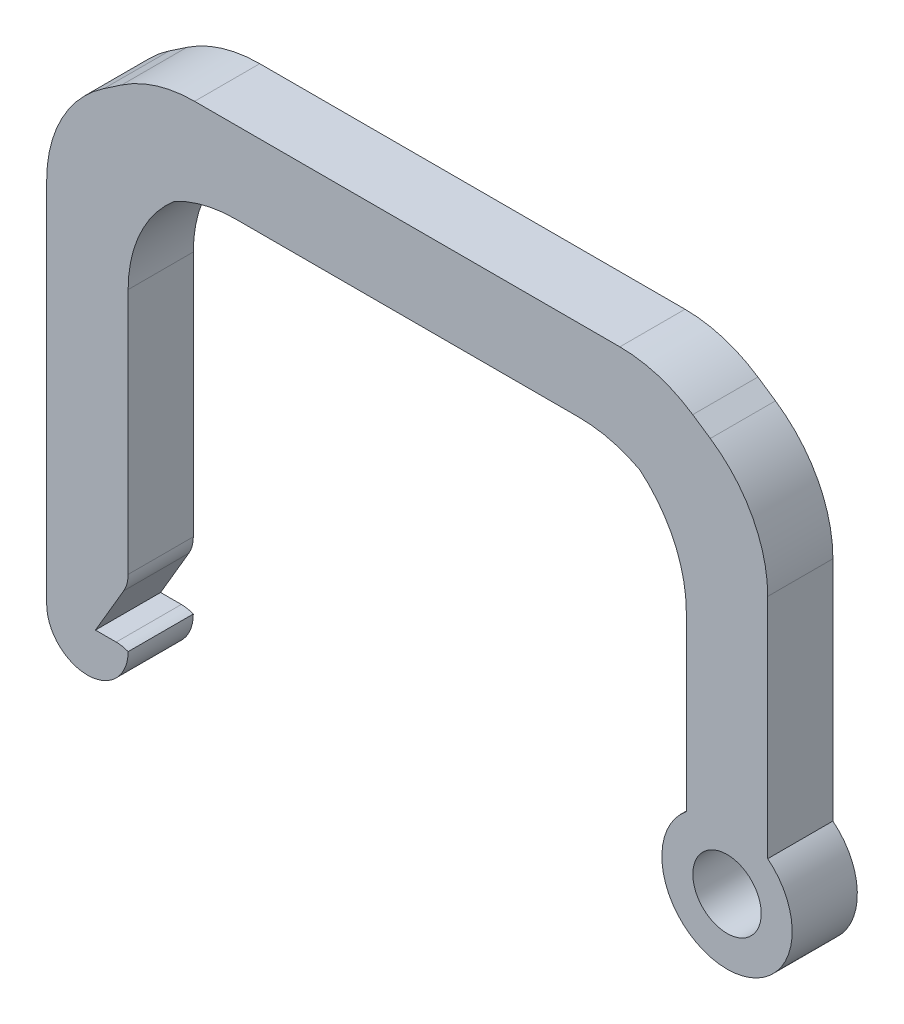
ISO-10303-21;
HEADER;
FILE_DESCRIPTION(('STEP AP214'),'2;1');
FILE_NAME('part.step','',(''),(''),'','','');
FILE_SCHEMA(('AUTOMOTIVE_DESIGN { 1 0 10303 214 1 1 1 1 }'));
ENDSEC;
DATA;
#1=APPLICATION_CONTEXT('core data for automotive mechanical design processes');
#2=APPLICATION_PROTOCOL_DEFINITION('international standard','automotive_design',2000,#1);
#3=PRODUCT_CONTEXT('',#1,'mechanical');
#4=PRODUCT('Part','Part','',(#3));
#5=PRODUCT_RELATED_PRODUCT_CATEGORY('part','',(#4));
#6=PRODUCT_DEFINITION_FORMATION('','',#4);
#7=PRODUCT_DEFINITION_CONTEXT('part definition',#1,'design');
#8=PRODUCT_DEFINITION('design','',#6,#7);
#9=PRODUCT_DEFINITION_SHAPE('','',#8);
#10=(LENGTH_UNIT() NAMED_UNIT(*) SI_UNIT(.MILLI.,.METRE.));
#11=(NAMED_UNIT(*) PLANE_ANGLE_UNIT() SI_UNIT($,.RADIAN.));
#12=(NAMED_UNIT(*) SI_UNIT($,.STERADIAN.) SOLID_ANGLE_UNIT());
#13=UNCERTAINTY_MEASURE_WITH_UNIT(LENGTH_MEASURE(1.E-05),#10,'distance_accuracy_value','');
#14=(GEOMETRIC_REPRESENTATION_CONTEXT(3) GLOBAL_UNCERTAINTY_ASSIGNED_CONTEXT((#13)) GLOBAL_UNIT_ASSIGNED_CONTEXT((#10,
#11,#12)) REPRESENTATION_CONTEXT('',''));
#15=CARTESIAN_POINT('',(0.,0.,0.));
#16=DIRECTION('',(0.,0.,1.));
#17=DIRECTION('',(1.,0.,0.));
#18=AXIS2_PLACEMENT_3D('',#15,#16,#17);
#19=CARTESIAN_POINT('',(22.1323005804403,-4.47354322776596,4.));
#20=DIRECTION('',(-0.559192903470745,-0.829037572555043,0.));
#21=DIRECTION('',(0.829037572555043,-0.559192903470745,0.));
#22=AXIS2_PLACEMENT_3D('',#19,#20,#21);
#23=PLANE('',#22);
#24=DIRECTION('',(-0.829037572555043,0.559192903470745,0.));
#25=VECTOR('',#24,1.);
#26=CARTESIAN_POINT('',(22.1323005804403,-4.47354322776596,4.));
#27=LINE('',#26,#25);
#28=CARTESIAN_POINT('',(18.6058438082063,-2.09491810061746,4.));
#29=VERTEX_POINT('',#28);
#30=CARTESIAN_POINT('',(17.5276977760967,-1.36769941955966,4.));
#31=VERTEX_POINT('',#30);
#32=EDGE_CURVE('E221',#29,#31,#27,.T.);
#33=ORIENTED_EDGE('',*,*,#32,.F.);
#34=DIRECTION('',(0.,0.,-1.));
#35=VECTOR('',#34,1.);
#36=CARTESIAN_POINT('',(18.6058438082063,-2.09491810061746,4.));
#37=LINE('',#36,#35);
#38=CARTESIAN_POINT('',(18.6058438082063,-2.09491810061746,0.));
#39=VERTEX_POINT('',#38);
#40=EDGE_CURVE('E279',#29,#39,#37,.T.);
#41=ORIENTED_EDGE('',*,*,#40,.T.);
#42=DIRECTION('',(-0.829037572555043,0.559192903470745,0.));
#43=VECTOR('',#42,1.);
#44=CARTESIAN_POINT('',(22.1323005804403,-4.47354322776596,0.));
#45=LINE('',#44,#43);
#46=CARTESIAN_POINT('',(17.5276977760967,-1.36769941955966,0.));
#47=VERTEX_POINT('',#46);
#48=EDGE_CURVE('E245',#39,#47,#45,.T.);
#49=ORIENTED_EDGE('',*,*,#48,.T.);
#50=DIRECTION('',(0.,0.,-1.));
#51=VECTOR('',#50,1.);
#52=CARTESIAN_POINT('',(17.5276977760967,-1.36769941955966,4.));
#53=LINE('',#52,#51);
#54=EDGE_CURVE('E277',#47,#31,#53,.F.);
#55=ORIENTED_EDGE('',*,*,#54,.T.);
#56=EDGE_LOOP('',(#33,#41,#49,#55));
#57=FACE_BOUND('',#56,.T.);
#58=ADVANCED_FACE('F33',(#57),#23,.F.);
#59=CARTESIAN_POINT('',(-15.5,0.,4.));
#60=DIRECTION('',(0.,-1.,0.));
#61=DIRECTION('',(0.,0.,-1.));
#62=AXIS2_PLACEMENT_3D('',#59,#60,#61);
#63=PLANE('',#62);
#64=DIRECTION('',(-1.,0.,0.));
#65=VECTOR('',#64,1.);
#66=CARTESIAN_POINT('',(-15.5,0.,4.));
#67=LINE('',#66,#65);
#68=CARTESIAN_POINT('',(13.0541545483307,0.,4.));
#69=VERTEX_POINT('',#68);
#70=CARTESIAN_POINT('',(-13.0541545483307,0.,4.));
#71=VERTEX_POINT('',#70);
#72=EDGE_CURVE('E224',#69,#71,#67,.T.);
#73=ORIENTED_EDGE('',*,*,#72,.F.);
#74=DIRECTION('',(0.,0.,-1.));
#75=VECTOR('',#74,1.);
#76=CARTESIAN_POINT('',(13.0541545483307,0.,4.));
#77=LINE('',#76,#75);
#78=CARTESIAN_POINT('',(13.0541545483307,0.,0.));
#79=VERTEX_POINT('',#78);
#80=EDGE_CURVE('E304',#69,#79,#77,.T.);
#81=ORIENTED_EDGE('',*,*,#80,.T.);
#82=DIRECTION('',(-1.,0.,0.));
#83=VECTOR('',#82,1.);
#84=CARTESIAN_POINT('',(-15.5,0.,0.));
#85=LINE('',#84,#83);
#86=CARTESIAN_POINT('',(-13.0541545483307,0.,0.));
#87=VERTEX_POINT('',#86);
#88=EDGE_CURVE('E248',#79,#87,#85,.T.);
#89=ORIENTED_EDGE('',*,*,#88,.T.);
#90=DIRECTION('',(0.,0.,-1.));
#91=VECTOR('',#90,1.);
#92=CARTESIAN_POINT('',(-13.0541545483307,0.,4.));
#93=LINE('',#92,#91);
#94=EDGE_CURVE('E302',#87,#71,#93,.F.);
#95=ORIENTED_EDGE('',*,*,#94,.T.);
#96=EDGE_LOOP('',(#73,#81,#89,#95));
#97=FACE_BOUND('',#96,.T.);
#98=ADVANCED_FACE('F426',(#97),#63,.F.);
#99=CARTESIAN_POINT('',(-15.5,0.,4.));
#100=DIRECTION('',(0.559192903470745,-0.829037572555043,0.));
#101=DIRECTION('',(0.829037572555043,0.559192903470745,0.));
#102=AXIS2_PLACEMENT_3D('',#99,#100,#101);
#103=PLANE('',#102);
#104=DIRECTION('',(-0.829037572555043,-0.559192903470745,0.));
#105=VECTOR('',#104,1.);
#106=CARTESIAN_POINT('',(-15.5,0.,4.));
#107=LINE('',#106,#105);
#108=CARTESIAN_POINT('',(-17.5276977760967,-1.36769941955966,4.));
#109=VERTEX_POINT('',#108);
#110=CARTESIAN_POINT('',(-18.6058438082063,-2.09491810061746,4.));
#111=VERTEX_POINT('',#110);
#112=EDGE_CURVE('E228',#109,#111,#107,.T.);
#113=ORIENTED_EDGE('',*,*,#112,.F.);
#114=DIRECTION('',(0.,0.,-1.));
#115=VECTOR('',#114,1.);
#116=CARTESIAN_POINT('',(-17.5276977760967,-1.36769941955966,4.));
#117=LINE('',#116,#115);
#118=CARTESIAN_POINT('',(-17.5276977760967,-1.36769941955966,0.));
#119=VERTEX_POINT('',#118);
#120=EDGE_CURVE('E309',#109,#119,#117,.T.);
#121=ORIENTED_EDGE('',*,*,#120,.T.);
#122=DIRECTION('',(-0.829037572555043,-0.559192903470745,0.));
#123=VECTOR('',#122,1.);
#124=CARTESIAN_POINT('',(-15.5,0.,0.));
#125=LINE('',#124,#123);
#126=CARTESIAN_POINT('',(-18.6058438082063,-2.09491810061746,0.));
#127=VERTEX_POINT('',#126);
#128=EDGE_CURVE('E252',#119,#127,#125,.T.);
#129=ORIENTED_EDGE('',*,*,#128,.T.);
#130=DIRECTION('',(0.,0.,-1.));
#131=VECTOR('',#130,1.);
#132=CARTESIAN_POINT('',(-18.6058438082063,-2.09491810061746,4.));
#133=LINE('',#132,#131);
#134=EDGE_CURVE('E307',#127,#111,#133,.F.);
#135=ORIENTED_EDGE('',*,*,#134,.T.);
#136=EDGE_LOOP('',(#113,#121,#129,#135));
#137=FACE_BOUND('',#136,.T.);
#138=ADVANCED_FACE('F434',(#137),#103,.F.);
#139=CARTESIAN_POINT('',(-22.1323005804403,-4.47354322776596,4.));
#140=DIRECTION('',(1.,0.,0.));
#141=DIRECTION('',(0.,1.,0.));
#142=AXIS2_PLACEMENT_3D('',#139,#140,#141);
#143=PLANE('',#142);
#144=DIRECTION('',(0.,-1.,0.));
#145=VECTOR('',#144,1.);
#146=CARTESIAN_POINT('',(-22.1323005804403,-4.47354322776596,0.));
#147=LINE('',#146,#145);
#148=CARTESIAN_POINT('',(-22.1323005804403,-8.72721868105781,0.));
#149=VERTEX_POINT('',#148);
#150=CARTESIAN_POINT('',(-22.1323005804403,-31.2959645173537,0.));
#151=VERTEX_POINT('',#150);
#152=EDGE_CURVE('E255',#149,#151,#147,.T.);
#153=ORIENTED_EDGE('',*,*,#152,.T.);
#154=DIRECTION('',(0.,0.,1.));
#155=VECTOR('',#154,1.);
#156=CARTESIAN_POINT('',(-22.1323005804403,-31.2959645173537,4.));
#157=LINE('',#156,#155);
#158=CARTESIAN_POINT('',(-22.1323005804403,-31.2959645173537,4.));
#159=VERTEX_POINT('',#158);
#160=EDGE_CURVE('E349',#151,#159,#157,.T.);
#161=ORIENTED_EDGE('',*,*,#160,.T.);
#162=DIRECTION('',(0.,-1.,0.));
#163=VECTOR('',#162,1.);
#164=CARTESIAN_POINT('',(-22.1323005804403,-4.47354322776596,4.));
#165=LINE('',#164,#163);
#166=CARTESIAN_POINT('',(-22.1323005804403,-8.72721868105781,4.));
#167=VERTEX_POINT('',#166);
#168=EDGE_CURVE('E231',#167,#159,#165,.T.);
#169=ORIENTED_EDGE('',*,*,#168,.F.);
#170=DIRECTION('',(0.,0.,-1.));
#171=VECTOR('',#170,1.);
#172=CARTESIAN_POINT('',(-22.1323005804403,-8.72721868105781,4.));
#173=LINE('',#172,#171);
#174=EDGE_CURVE('E312',#167,#149,#173,.T.);
#175=ORIENTED_EDGE('',*,*,#174,.T.);
#176=EDGE_LOOP('',(#153,#161,#169,#175));
#177=FACE_BOUND('',#176,.T.);
#178=ADVANCED_FACE('F443',(#177),#143,.F.);
#179=CARTESIAN_POINT('',(-17.1323005804403,-22.7959645173537,4.));
#180=DIRECTION('',(-1.,0.,0.));
#181=DIRECTION('',(0.,0.,1.));
#182=AXIS2_PLACEMENT_3D('',#179,#180,#181);
#183=PLANE('',#182);
#184=DIRECTION('',(0.,1.,0.));
#185=VECTOR('',#184,1.);
#186=CARTESIAN_POINT('',(-17.1323005804403,-22.7959645173537,4.));
#187=LINE('',#186,#185);
#188=CARTESIAN_POINT('',(-17.1323005804403,-27.1916649730662,4.));
#189=VERTEX_POINT('',#188);
#190=CARTESIAN_POINT('',(-17.1323005804403,-12.0496399706456,4.));
#191=VERTEX_POINT('',#190);
#192=EDGE_CURVE('E234',#189,#191,#187,.T.);
#193=ORIENTED_EDGE('',*,*,#192,.F.);
#194=DIRECTION('',(0.,0.,1.));
#195=VECTOR('',#194,1.);
#196=CARTESIAN_POINT('',(-17.1323005804403,-27.1916649730662,4.));
#197=LINE('',#196,#195);
#198=CARTESIAN_POINT('',(-17.1323005804403,-27.1916649730662,0.));
#199=VERTEX_POINT('',#198);
#200=EDGE_CURVE('E359',#189,#199,#197,.F.);
#201=ORIENTED_EDGE('',*,*,#200,.T.);
#202=DIRECTION('',(0.,1.,0.));
#203=VECTOR('',#202,1.);
#204=CARTESIAN_POINT('',(-17.1323005804403,-22.7959645173537,0.));
#205=LINE('',#204,#203);
#206=CARTESIAN_POINT('',(-17.1323005804403,-12.0496399706456,0.));
#207=VERTEX_POINT('',#206);
#208=EDGE_CURVE('E258',#199,#207,#205,.T.);
#209=ORIENTED_EDGE('',*,*,#208,.T.);
#210=DIRECTION('',(0.,0.,-1.));
#211=VECTOR('',#210,1.);
#212=CARTESIAN_POINT('',(-17.1323005804403,-12.0496399706456,4.));
#213=LINE('',#212,#211);
#214=EDGE_CURVE('E271',#207,#191,#213,.F.);
#215=ORIENTED_EDGE('',*,*,#214,.T.);
#216=EDGE_LOOP('',(#193,#201,#209,#215));
#217=FACE_BOUND('',#216,.T.);
#218=ADVANCED_FACE('F372',(#217),#183,.F.);
#219=CARTESIAN_POINT('',(-12.9871127176651,-5.,4.));
#220=DIRECTION('',(0.,1.,0.));
#221=DIRECTION('',(-1.,0.,0.));
#222=AXIS2_PLACEMENT_3D('',#219,#220,#221);
#223=PLANE('',#222);
#224=DIRECTION('',(1.,0.,0.));
#225=VECTOR('',#224,1.);
#226=CARTESIAN_POINT('',(-12.9871127176651,-5.,4.));
#227=LINE('',#226,#225);
#228=CARTESIAN_POINT('',(-10.5412672659959,-5.,4.));
#229=VERTEX_POINT('',#228);
#230=CARTESIAN_POINT('',(10.5412672659959,-5.,4.));
#231=VERTEX_POINT('',#230);
#232=EDGE_CURVE('E236',#229,#231,#227,.T.);
#233=ORIENTED_EDGE('',*,*,#232,.F.);
#234=DIRECTION('',(0.,0.,-1.));
#235=VECTOR('',#234,1.);
#236=CARTESIAN_POINT('',(-10.5412672659959,-5.,0.));
#237=LINE('',#236,#235);
#238=CARTESIAN_POINT('',(-10.5412672659959,-5.,0.));
#239=VERTEX_POINT('',#238);
#240=EDGE_CURVE('E268',#229,#239,#237,.T.);
#241=ORIENTED_EDGE('',*,*,#240,.T.);
#242=DIRECTION('',(1.,0.,0.));
#243=VECTOR('',#242,1.);
#244=CARTESIAN_POINT('',(-12.9871127176651,-5.,0.));
#245=LINE('',#244,#243);
#246=CARTESIAN_POINT('',(10.5412672659959,-5.,0.));
#247=VERTEX_POINT('',#246);
#248=EDGE_CURVE('E260',#239,#247,#245,.T.);
#249=ORIENTED_EDGE('',*,*,#248,.T.);
#250=DIRECTION('',(0.,0.,-1.));
#251=VECTOR('',#250,1.);
#252=CARTESIAN_POINT('',(10.5412672659958,-5.,4.));
#253=LINE('',#252,#251);
#254=EDGE_CURVE('E244',#247,#231,#253,.F.);
#255=ORIENTED_EDGE('',*,*,#254,.T.);
#256=EDGE_LOOP('',(#233,#241,#249,#255));
#257=FACE_BOUND('',#256,.T.);
#258=ADVANCED_FACE('F385',(#257),#223,.F.);
#259=CARTESIAN_POINT('',(17.1323005804403,-7.79596451735372,4.));
#260=DIRECTION('',(1.,0.,0.));
#261=DIRECTION('',(0.,1.,0.));
#262=AXIS2_PLACEMENT_3D('',#259,#260,#261);
#263=PLANE('',#262);
#264=DIRECTION('',(0.,-1.,0.));
#265=VECTOR('',#264,1.);
#266=CARTESIAN_POINT('',(17.1323005804403,-7.79596451735372,0.));
#267=LINE('',#266,#265);
#268=CARTESIAN_POINT('',(17.1323005804403,-12.0496399706456,0.));
#269=VERTEX_POINT('',#268);
#270=CARTESIAN_POINT('',(17.1323005804403,-22.6734655181545,0.));
#271=VERTEX_POINT('',#270);
#272=EDGE_CURVE('E263',#269,#271,#267,.T.);
#273=ORIENTED_EDGE('',*,*,#272,.T.);
#274=DIRECTION('',(0.,0.,1.));
#275=VECTOR('',#274,1.);
#276=CARTESIAN_POINT('',(17.1323005804403,-22.6734655181545,0.));
#277=LINE('',#276,#275);
#278=CARTESIAN_POINT('',(17.1323005804403,-22.6734655181545,4.));
#279=VERTEX_POINT('',#278);
#280=EDGE_CURVE('E217',#271,#279,#277,.T.);
#281=ORIENTED_EDGE('',*,*,#280,.T.);
#282=DIRECTION('',(0.,-1.,0.));
#283=VECTOR('',#282,1.);
#284=CARTESIAN_POINT('',(17.1323005804403,-7.79596451735372,4.));
#285=LINE('',#284,#283);
#286=CARTESIAN_POINT('',(17.1323005804403,-12.0496399706456,4.));
#287=VERTEX_POINT('',#286);
#288=EDGE_CURVE('E239',#287,#279,#285,.T.);
#289=ORIENTED_EDGE('',*,*,#288,.F.);
#290=DIRECTION('',(0.,0.,-1.));
#291=VECTOR('',#290,1.);
#292=CARTESIAN_POINT('',(17.1323005804403,-12.0496399706456,0.));
#293=LINE('',#292,#291);
#294=EDGE_CURVE('E274',#287,#269,#293,.T.);
#295=ORIENTED_EDGE('',*,*,#294,.T.);
#296=EDGE_LOOP('',(#273,#281,#289,#295));
#297=FACE_BOUND('',#296,.T.);
#298=ADVANCED_FACE('F398',(#297),#263,.F.);
#299=CARTESIAN_POINT('',(22.1323005804403,-22.7959645173537,4.));
#300=DIRECTION('',(-1.,0.,0.));
#301=DIRECTION('',(0.,0.,1.));
#302=AXIS2_PLACEMENT_3D('',#299,#300,#301);
#303=PLANE('',#302);
#304=DIRECTION('',(0.,1.,0.));
#305=VECTOR('',#304,1.);
#306=CARTESIAN_POINT('',(22.1323005804403,-22.7959645173537,4.));
#307=LINE('',#306,#305);
#308=CARTESIAN_POINT('',(22.1323005804403,-22.6734655181545,4.));
#309=VERTEX_POINT('',#308);
#310=CARTESIAN_POINT('',(22.1323005804403,-8.7272186810578,4.));
#311=VERTEX_POINT('',#310);
#312=EDGE_CURVE('E242',#309,#311,#307,.T.);
#313=ORIENTED_EDGE('',*,*,#312,.F.);
#314=DIRECTION('',(0.,0.,1.));
#315=VECTOR('',#314,1.);
#316=CARTESIAN_POINT('',(22.1323005804403,-22.6734655181545,0.));
#317=LINE('',#316,#315);
#318=CARTESIAN_POINT('',(22.1323005804403,-22.6734655181545,0.));
#319=VERTEX_POINT('',#318);
#320=EDGE_CURVE('E212',#309,#319,#317,.F.);
#321=ORIENTED_EDGE('',*,*,#320,.T.);
#322=DIRECTION('',(0.,1.,0.));
#323=VECTOR('',#322,1.);
#324=CARTESIAN_POINT('',(22.1323005804403,-22.7959645173537,0.));
#325=LINE('',#324,#323);
#326=CARTESIAN_POINT('',(22.1323005804403,-8.7272186810578,0.));
#327=VERTEX_POINT('',#326);
#328=EDGE_CURVE('E225',#319,#327,#325,.T.);
#329=ORIENTED_EDGE('',*,*,#328,.T.);
#330=DIRECTION('',(0.,0.,-1.));
#331=VECTOR('',#330,1.);
#332=CARTESIAN_POINT('',(22.1323005804403,-8.7272186810578,4.));
#333=LINE('',#332,#331);
#334=EDGE_CURVE('E291',#327,#311,#333,.F.);
#335=ORIENTED_EDGE('',*,*,#334,.T.);
#336=EDGE_LOOP('',(#313,#321,#329,#335));
#337=FACE_BOUND('',#336,.T.);
#338=ADVANCED_FACE('F408',(#337),#303,.F.);
#339=CARTESIAN_POINT('',(0.,0.,4.));
#340=DIRECTION('',(0.,0.,1.));
#341=DIRECTION('',(1.,0.,0.));
#342=AXIS2_PLACEMENT_3D('',#339,#340,#341);
#343=PLANE('',#342);
#344=CARTESIAN_POINT('',(-19.6323005804403,-31.2959645173537,4.));
#345=DIRECTION('',(0.,0.,1.));
#346=DIRECTION('',(1.,0.,0.));
#347=AXIS2_PLACEMENT_3D('',#344,#345,#346);
#348=CIRCLE('',#347,2.5);
#349=CARTESIAN_POINT('',(-19.6323005804403,-33.7959645173537,4.));
#350=VERTEX_POINT('',#349);
#351=CARTESIAN_POINT('',(-17.1323005804403,-31.2959645173537,4.));
#352=VERTEX_POINT('',#351);
#353=EDGE_CURVE('E340',#350,#352,#348,.T.);
#354=ORIENTED_EDGE('',*,*,#353,.T.);
#355=CARTESIAN_POINT('',(-17.8665254026191,-33.1563176855711,4.));
#356=DIRECTION('',(0.,0.,1.));
#357=DIRECTION('',(1.,0.,0.));
#358=AXIS2_PLACEMENT_3D('',#355,#356,#357);
#359=CIRCLE('',#358,2.);
#360=CARTESIAN_POINT('',(-17.8665254026191,-31.1563176855711,4.));
#361=VERTEX_POINT('',#360);
#362=EDGE_CURVE('E55',#352,#361,#359,.T.);
#363=ORIENTED_EDGE('',*,*,#362,.T.);
#364=DIRECTION('',(1.,0.,0.));
#365=VECTOR('',#364,1.);
#366=CARTESIAN_POINT('',(-17.1323005804403,-31.1563176855711,4.));
#367=LINE('',#366,#365);
#368=CARTESIAN_POINT('',(-19.1396490556001,-31.1563176855711,4.));
#369=VERTEX_POINT('',#368);
#370=EDGE_CURVE('E196',#369,#361,#367,.T.);
#371=ORIENTED_EDGE('',*,*,#370,.F.);
#372=DIRECTION('',(-0.506056446293962,-0.862500361254606,0.));
#373=VECTOR('',#372,1.);
#374=CARTESIAN_POINT('',(-19.1396490556001,-31.1563176855711,4.));
#375=LINE('',#374,#373);
#376=CARTESIAN_POINT('',(-17.4072998579311,-28.2037778656542,4.));
#377=VERTEX_POINT('',#376);
#378=EDGE_CURVE('E189',#377,#369,#375,.T.);
#379=ORIENTED_EDGE('',*,*,#378,.F.);
#380=CARTESIAN_POINT('',(-19.1323005804403,-27.1916649730662,4.));
#381=DIRECTION('',(0.,0.,1.));
#382=DIRECTION('',(1.,0.,0.));
#383=AXIS2_PLACEMENT_3D('',#380,#381,#382);
#384=CIRCLE('',#383,2.);
#385=EDGE_CURVE('E357',#377,#189,#384,.T.);
#386=ORIENTED_EDGE('',*,*,#385,.T.);
#387=ORIENTED_EDGE('',*,*,#192,.T.);
#388=CARTESIAN_POINT('',(-9.13230058044034,-12.0496399706456,4.));
#389=DIRECTION('',(0.,0.,1.));
#390=DIRECTION('',(1.,0.,0.));
#391=AXIS2_PLACEMENT_3D('',#388,#389,#390);
#392=CIRCLE('',#391,8.);
#393=CARTESIAN_POINT('',(-14.285018737652,-5.9300406706635,4.));
#394=VERTEX_POINT('',#393);
#395=EDGE_CURVE('E322',#191,#394,#392,.F.);
#396=ORIENTED_EDGE('',*,*,#395,.T.);
#397=CARTESIAN_POINT('',(-10.5412672659959,-13.,4.));
#398=DIRECTION('',(0.,0.,1.));
#399=DIRECTION('',(1.,0.,0.));
#400=AXIS2_PLACEMENT_3D('',#397,#398,#399);
#401=CIRCLE('',#400,8.);
#402=EDGE_CURVE('E317',#394,#229,#401,.F.);
#403=ORIENTED_EDGE('',*,*,#402,.T.);
#404=ORIENTED_EDGE('',*,*,#232,.T.);
#405=CARTESIAN_POINT('',(10.5412672659958,-13.,4.));
#406=DIRECTION('',(0.,0.,1.));
#407=DIRECTION('',(1.,0.,0.));
#408=AXIS2_PLACEMENT_3D('',#405,#406,#407);
#409=CIRCLE('',#408,8.);
#410=CARTESIAN_POINT('',(14.285018737652,-5.9300406706635,4.));
#411=VERTEX_POINT('',#410);
#412=EDGE_CURVE('E330',#231,#411,#409,.F.);
#413=ORIENTED_EDGE('',*,*,#412,.T.);
#414=CARTESIAN_POINT('',(9.13230058044034,-12.0496399706456,4.));
#415=DIRECTION('',(0.,0.,1.));
#416=DIRECTION('',(1.,0.,0.));
#417=AXIS2_PLACEMENT_3D('',#414,#415,#416);
#418=CIRCLE('',#417,8.);
#419=EDGE_CURVE('E326',#411,#287,#418,.F.);
#420=ORIENTED_EDGE('',*,*,#419,.T.);
#421=ORIENTED_EDGE('',*,*,#288,.T.);
#422=CARTESIAN_POINT('',(19.6323005804403,-25.7959645173537,4.));
#423=DIRECTION('',(0.,0.,1.));
#424=DIRECTION('',(1.,0.,0.));
#425=AXIS2_PLACEMENT_3D('',#422,#423,#424);
#426=CIRCLE('',#425,4.);
#427=EDGE_CURVE('E213',#279,#309,#426,.T.);
#428=ORIENTED_EDGE('',*,*,#427,.T.);
#429=ORIENTED_EDGE('',*,*,#312,.T.);
#430=CARTESIAN_POINT('',(14.1323005804403,-8.7272186810578,4.));
#431=DIRECTION('',(0.,0.,1.));
#432=DIRECTION('',(1.,0.,0.));
#433=AXIS2_PLACEMENT_3D('',#430,#431,#432);
#434=CIRCLE('',#433,8.);
#435=EDGE_CURVE('E300',#311,#29,#434,.T.);
#436=ORIENTED_EDGE('',*,*,#435,.T.);
#437=ORIENTED_EDGE('',*,*,#32,.T.);
#438=CARTESIAN_POINT('',(13.0541545483307,-8.,4.));
#439=DIRECTION('',(0.,0.,1.));
#440=DIRECTION('',(1.,0.,0.));
#441=AXIS2_PLACEMENT_3D('',#438,#439,#440);
#442=CIRCLE('',#441,8.);
#443=EDGE_CURVE('E298',#31,#69,#442,.T.);
#444=ORIENTED_EDGE('',*,*,#443,.T.);
#445=ORIENTED_EDGE('',*,*,#72,.T.);
#446=CARTESIAN_POINT('',(-13.0541545483307,-8.,4.));
#447=DIRECTION('',(0.,0.,1.));
#448=DIRECTION('',(1.,0.,0.));
#449=AXIS2_PLACEMENT_3D('',#446,#447,#448);
#450=CIRCLE('',#449,8.);
#451=EDGE_CURVE('E296',#71,#109,#450,.T.);
#452=ORIENTED_EDGE('',*,*,#451,.T.);
#453=ORIENTED_EDGE('',*,*,#112,.T.);
#454=CARTESIAN_POINT('',(-14.1323005804403,-8.72721868105781,4.));
#455=DIRECTION('',(0.,0.,1.));
#456=DIRECTION('',(1.,0.,0.));
#457=AXIS2_PLACEMENT_3D('',#454,#455,#456);
#458=CIRCLE('',#457,8.);
#459=EDGE_CURVE('E294',#111,#167,#458,.T.);
#460=ORIENTED_EDGE('',*,*,#459,.T.);
#461=ORIENTED_EDGE('',*,*,#168,.T.);
#462=CARTESIAN_POINT('',(-19.6323005804403,-31.2959645173537,4.));
#463=DIRECTION('',(0.,0.,1.));
#464=DIRECTION('',(1.,0.,0.));
#465=AXIS2_PLACEMENT_3D('',#462,#463,#464);
#466=CIRCLE('',#465,2.5);
#467=EDGE_CURVE('E332',#159,#350,#466,.T.);
#468=ORIENTED_EDGE('',*,*,#467,.T.);
#469=EDGE_LOOP('',(#354,#363,#371,#379,#386,#387,#396,#403,#404,#413,#420,#421,#428,#429,#436,
#437,#444,#445,#452,#453,#460,#461,#468));
#470=FACE_BOUND('',#469,.T.);
#471=CARTESIAN_POINT('',(19.6323005804403,-25.7959645173537,4.));
#472=DIRECTION('',(0.,0.,1.));
#473=DIRECTION('',(1.,0.,0.));
#474=AXIS2_PLACEMENT_3D('',#471,#472,#473);
#475=CIRCLE('',#474,2.1);
#476=CARTESIAN_POINT('',(21.7323005804403,-25.7959645173537,4.));
#477=VERTEX_POINT('',#476);
#478=EDGE_CURVE('E206',#477,#477,#475,.T.);
#479=ORIENTED_EDGE('',*,*,#478,.F.);
#480=EDGE_LOOP('',(#479));
#481=FACE_BOUND('',#480,.T.);
#482=ADVANCED_FACE('F202',(#470,#481),#343,.T.);
#483=CARTESIAN_POINT('',(0.,0.,0.));
#484=DIRECTION('',(0.,0.,1.));
#485=DIRECTION('',(1.,0.,0.));
#486=AXIS2_PLACEMENT_3D('',#483,#484,#485);
#487=PLANE('',#486);
#488=CARTESIAN_POINT('',(19.6323005804403,-25.7959645173537,0.));
#489=DIRECTION('',(0.,0.,1.));
#490=DIRECTION('',(1.,0.,0.));
#491=AXIS2_PLACEMENT_3D('',#488,#489,#490);
#492=CIRCLE('',#491,2.1);
#493=CARTESIAN_POINT('',(21.7323005804403,-25.7959645173537,0.));
#494=VERTEX_POINT('',#493);
#495=EDGE_CURVE('E209',#494,#494,#492,.T.);
#496=ORIENTED_EDGE('',*,*,#495,.T.);
#497=EDGE_LOOP('',(#496));
#498=FACE_BOUND('',#497,.T.);
#499=DIRECTION('',(1.,0.,0.));
#500=VECTOR('',#499,1.);
#501=CARTESIAN_POINT('',(0.,-31.1563176855711,0.));
#502=LINE('',#501,#500);
#503=CARTESIAN_POINT('',(-19.1396490556001,-31.1563176855711,0.));
#504=VERTEX_POINT('',#503);
#505=CARTESIAN_POINT('',(-17.8665254026191,-31.1563176855711,0.));
#506=VERTEX_POINT('',#505);
#507=EDGE_CURVE('E199',#504,#506,#502,.T.);
#508=ORIENTED_EDGE('',*,*,#507,.T.);
#509=CARTESIAN_POINT('',(-17.8665254026191,-33.1563176855711,0.));
#510=DIRECTION('',(0.,0.,1.));
#511=DIRECTION('',(1.,0.,0.));
#512=AXIS2_PLACEMENT_3D('',#509,#510,#511);
#513=CIRCLE('',#512,2.);
#514=CARTESIAN_POINT('',(-17.1323005804403,-31.2959645173537,0.));
#515=VERTEX_POINT('',#514);
#516=EDGE_CURVE('E11',#506,#515,#513,.F.);
#517=ORIENTED_EDGE('',*,*,#516,.T.);
#518=CARTESIAN_POINT('',(-19.6323005804403,-31.2959645173537,0.));
#519=DIRECTION('',(0.,0.,1.));
#520=DIRECTION('',(1.,0.,0.));
#521=AXIS2_PLACEMENT_3D('',#518,#519,#520);
#522=CIRCLE('',#521,2.5);
#523=CARTESIAN_POINT('',(-19.6323005804403,-33.7959645173537,0.));
#524=VERTEX_POINT('',#523);
#525=EDGE_CURVE('E347',#515,#524,#522,.F.);
#526=ORIENTED_EDGE('',*,*,#525,.T.);
#527=CARTESIAN_POINT('',(-19.6323005804403,-31.2959645173537,0.));
#528=DIRECTION('',(0.,0.,1.));
#529=DIRECTION('',(1.,0.,0.));
#530=AXIS2_PLACEMENT_3D('',#527,#528,#529);
#531=CIRCLE('',#530,2.5);
#532=EDGE_CURVE('E345',#524,#151,#531,.F.);
#533=ORIENTED_EDGE('',*,*,#532,.T.);
#534=ORIENTED_EDGE('',*,*,#152,.F.);
#535=CARTESIAN_POINT('',(-14.1323005804403,-8.72721868105781,0.));
#536=DIRECTION('',(0.,0.,1.));
#537=DIRECTION('',(1.,0.,0.));
#538=AXIS2_PLACEMENT_3D('',#535,#536,#537);
#539=CIRCLE('',#538,8.);
#540=EDGE_CURVE('E282',#149,#127,#539,.F.);
#541=ORIENTED_EDGE('',*,*,#540,.T.);
#542=ORIENTED_EDGE('',*,*,#128,.F.);
#543=CARTESIAN_POINT('',(-13.0541545483307,-8.,0.));
#544=DIRECTION('',(0.,0.,1.));
#545=DIRECTION('',(1.,0.,0.));
#546=AXIS2_PLACEMENT_3D('',#543,#544,#545);
#547=CIRCLE('',#546,8.);
#548=EDGE_CURVE('E284',#119,#87,#547,.F.);
#549=ORIENTED_EDGE('',*,*,#548,.T.);
#550=ORIENTED_EDGE('',*,*,#88,.F.);
#551=CARTESIAN_POINT('',(13.0541545483307,-8.,0.));
#552=DIRECTION('',(0.,0.,1.));
#553=DIRECTION('',(1.,0.,0.));
#554=AXIS2_PLACEMENT_3D('',#551,#552,#553);
#555=CIRCLE('',#554,8.);
#556=EDGE_CURVE('E286',#79,#47,#555,.F.);
#557=ORIENTED_EDGE('',*,*,#556,.T.);
#558=ORIENTED_EDGE('',*,*,#48,.F.);
#559=CARTESIAN_POINT('',(14.1323005804403,-8.7272186810578,0.));
#560=DIRECTION('',(0.,0.,1.));
#561=DIRECTION('',(1.,0.,0.));
#562=AXIS2_PLACEMENT_3D('',#559,#560,#561);
#563=CIRCLE('',#562,8.);
#564=EDGE_CURVE('E288',#39,#327,#563,.F.);
#565=ORIENTED_EDGE('',*,*,#564,.T.);
#566=ORIENTED_EDGE('',*,*,#328,.F.);
#567=CARTESIAN_POINT('',(19.6323005804403,-25.7959645173537,0.));
#568=DIRECTION('',(0.,0.,1.));
#569=DIRECTION('',(1.,0.,0.));
#570=AXIS2_PLACEMENT_3D('',#567,#568,#569);
#571=CIRCLE('',#570,4.);
#572=EDGE_CURVE('E210',#271,#319,#571,.T.);
#573=ORIENTED_EDGE('',*,*,#572,.F.);
#574=ORIENTED_EDGE('',*,*,#272,.F.);
#575=CARTESIAN_POINT('',(9.13230058044034,-12.0496399706456,0.));
#576=DIRECTION('',(0.,0.,1.));
#577=DIRECTION('',(1.,0.,0.));
#578=AXIS2_PLACEMENT_3D('',#575,#576,#577);
#579=CIRCLE('',#578,8.);
#580=CARTESIAN_POINT('',(14.285018737652,-5.9300406706635,0.));
#581=VERTEX_POINT('',#580);
#582=EDGE_CURVE('E324',#269,#581,#579,.T.);
#583=ORIENTED_EDGE('',*,*,#582,.T.);
#584=CARTESIAN_POINT('',(10.5412672659958,-13.,0.));
#585=DIRECTION('',(0.,0.,1.));
#586=DIRECTION('',(1.,0.,0.));
#587=AXIS2_PLACEMENT_3D('',#584,#585,#586);
#588=CIRCLE('',#587,8.);
#589=EDGE_CURVE('E328',#581,#247,#588,.T.);
#590=ORIENTED_EDGE('',*,*,#589,.T.);
#591=ORIENTED_EDGE('',*,*,#248,.F.);
#592=CARTESIAN_POINT('',(-10.5412672659959,-13.,0.));
#593=DIRECTION('',(0.,0.,1.));
#594=DIRECTION('',(1.,0.,0.));
#595=AXIS2_PLACEMENT_3D('',#592,#593,#594);
#596=CIRCLE('',#595,8.);
#597=CARTESIAN_POINT('',(-14.285018737652,-5.9300406706635,0.));
#598=VERTEX_POINT('',#597);
#599=EDGE_CURVE('E315',#239,#598,#596,.T.);
#600=ORIENTED_EDGE('',*,*,#599,.T.);
#601=CARTESIAN_POINT('',(-9.13230058044034,-12.0496399706456,0.));
#602=DIRECTION('',(0.,0.,1.));
#603=DIRECTION('',(1.,0.,0.));
#604=AXIS2_PLACEMENT_3D('',#601,#602,#603);
#605=CIRCLE('',#604,8.);
#606=EDGE_CURVE('E319',#598,#207,#605,.T.);
#607=ORIENTED_EDGE('',*,*,#606,.T.);
#608=ORIENTED_EDGE('',*,*,#208,.F.);
#609=CARTESIAN_POINT('',(-19.1323005804403,-27.1916649730662,0.));
#610=DIRECTION('',(0.,0.,1.));
#611=DIRECTION('',(1.,0.,0.));
#612=AXIS2_PLACEMENT_3D('',#609,#610,#611);
#613=CIRCLE('',#612,2.);
#614=CARTESIAN_POINT('',(-17.4072998579311,-28.2037778656542,0.));
#615=VERTEX_POINT('',#614);
#616=EDGE_CURVE('E361',#199,#615,#613,.F.);
#617=ORIENTED_EDGE('',*,*,#616,.T.);
#618=DIRECTION('',(-0.506056446293962,-0.862500361254606,0.));
#619=VECTOR('',#618,1.);
#620=CARTESIAN_POINT('',(-0.639197997539323,0.375037833772546,0.));
#621=LINE('',#620,#619);
#622=EDGE_CURVE('E351',#615,#504,#621,.T.);
#623=ORIENTED_EDGE('',*,*,#622,.T.);
#624=EDGE_LOOP('',(#508,#517,#526,#533,#534,#541,#542,#549,#550,#557,#558,#565,#566,#573,#574,
#583,#590,#591,#600,#607,#608,#617,#623));
#625=FACE_BOUND('',#624,.T.);
#626=ADVANCED_FACE('F366',(#498,#625),#487,.F.);
#627=CARTESIAN_POINT('',(-9.13230058044034,-12.0496399706456,4.));
#628=DIRECTION('',(0.,0.,1.));
#629=DIRECTION('',(1.,0.,0.));
#630=AXIS2_PLACEMENT_3D('',#627,#628,#629);
#631=CYLINDRICAL_SURFACE('',#630,8.);
#632=DIRECTION('',(0.,0.,1.));
#633=VECTOR('',#632,1.);
#634=CARTESIAN_POINT('',(-14.285018737652,-5.9300406706635,2.));
#635=LINE('',#634,#633);
#636=EDGE_CURVE('E249',#394,#598,#635,.F.);
#637=ORIENTED_EDGE('',*,*,#636,.F.);
#638=ORIENTED_EDGE('',*,*,#395,.F.);
#639=ORIENTED_EDGE('',*,*,#214,.F.);
#640=ORIENTED_EDGE('',*,*,#606,.F.);
#641=EDGE_LOOP('',(#637,#638,#639,#640));
#642=FACE_BOUND('',#641,.T.);
#643=ADVANCED_FACE('F378',(#642),#631,.F.);
#644=CARTESIAN_POINT('',(-10.5412672659959,-13.,4.));
#645=DIRECTION('',(0.,0.,1.));
#646=DIRECTION('',(1.,0.,0.));
#647=AXIS2_PLACEMENT_3D('',#644,#645,#646);
#648=CYLINDRICAL_SURFACE('',#647,8.);
#649=ORIENTED_EDGE('',*,*,#402,.F.);
#650=ORIENTED_EDGE('',*,*,#636,.T.);
#651=ORIENTED_EDGE('',*,*,#599,.F.);
#652=ORIENTED_EDGE('',*,*,#240,.F.);
#653=EDGE_LOOP('',(#649,#650,#651,#652));
#654=FACE_BOUND('',#653,.T.);
#655=ADVANCED_FACE('F388',(#654),#648,.F.);
#656=CARTESIAN_POINT('',(10.5412672659958,-13.,4.));
#657=DIRECTION('',(0.,0.,1.));
#658=DIRECTION('',(1.,0.,0.));
#659=AXIS2_PLACEMENT_3D('',#656,#657,#658);
#660=CYLINDRICAL_SURFACE('',#659,8.);
#661=DIRECTION('',(0.,0.,1.));
#662=VECTOR('',#661,1.);
#663=CARTESIAN_POINT('',(14.285018737652,-5.9300406706635,2.));
#664=LINE('',#663,#662);
#665=EDGE_CURVE('E220',#411,#581,#664,.F.);
#666=ORIENTED_EDGE('',*,*,#665,.F.);
#667=ORIENTED_EDGE('',*,*,#412,.F.);
#668=ORIENTED_EDGE('',*,*,#254,.F.);
#669=ORIENTED_EDGE('',*,*,#589,.F.);
#670=EDGE_LOOP('',(#666,#667,#668,#669));
#671=FACE_BOUND('',#670,.T.);
#672=ADVANCED_FACE('F392',(#671),#660,.F.);
#673=CARTESIAN_POINT('',(9.13230058044034,-12.0496399706456,4.));
#674=DIRECTION('',(0.,0.,1.));
#675=DIRECTION('',(1.,0.,0.));
#676=AXIS2_PLACEMENT_3D('',#673,#674,#675);
#677=CYLINDRICAL_SURFACE('',#676,8.);
#678=ORIENTED_EDGE('',*,*,#419,.F.);
#679=ORIENTED_EDGE('',*,*,#665,.T.);
#680=ORIENTED_EDGE('',*,*,#582,.F.);
#681=ORIENTED_EDGE('',*,*,#294,.F.);
#682=EDGE_LOOP('',(#678,#679,#680,#681));
#683=FACE_BOUND('',#682,.T.);
#684=ADVANCED_FACE('F400',(#683),#677,.F.);
#685=CARTESIAN_POINT('',(14.1323005804403,-8.7272186810578,4.));
#686=DIRECTION('',(0.,0.,-1.));
#687=DIRECTION('',(-1.,0.,0.));
#688=AXIS2_PLACEMENT_3D('',#685,#686,#687);
#689=CYLINDRICAL_SURFACE('',#688,8.);
#690=ORIENTED_EDGE('',*,*,#435,.F.);
#691=ORIENTED_EDGE('',*,*,#334,.F.);
#692=ORIENTED_EDGE('',*,*,#564,.F.);
#693=ORIENTED_EDGE('',*,*,#40,.F.);
#694=EDGE_LOOP('',(#690,#691,#692,#693));
#695=FACE_BOUND('',#694,.T.);
#696=ADVANCED_FACE('F418',(#695),#689,.T.);
#697=CARTESIAN_POINT('',(13.0541545483307,-8.,4.));
#698=DIRECTION('',(0.,0.,-1.));
#699=DIRECTION('',(-1.,0.,0.));
#700=AXIS2_PLACEMENT_3D('',#697,#698,#699);
#701=CYLINDRICAL_SURFACE('',#700,8.);
#702=ORIENTED_EDGE('',*,*,#443,.F.);
#703=ORIENTED_EDGE('',*,*,#54,.F.);
#704=ORIENTED_EDGE('',*,*,#556,.F.);
#705=ORIENTED_EDGE('',*,*,#80,.F.);
#706=EDGE_LOOP('',(#702,#703,#704,#705));
#707=FACE_BOUND('',#706,.T.);
#708=ADVANCED_FACE('F421',(#707),#701,.T.);
#709=CARTESIAN_POINT('',(-13.0541545483307,-8.,4.));
#710=DIRECTION('',(0.,0.,-1.));
#711=DIRECTION('',(-1.,0.,0.));
#712=AXIS2_PLACEMENT_3D('',#709,#710,#711);
#713=CYLINDRICAL_SURFACE('',#712,8.);
#714=ORIENTED_EDGE('',*,*,#451,.F.);
#715=ORIENTED_EDGE('',*,*,#94,.F.);
#716=ORIENTED_EDGE('',*,*,#548,.F.);
#717=ORIENTED_EDGE('',*,*,#120,.F.);
#718=EDGE_LOOP('',(#714,#715,#716,#717));
#719=FACE_BOUND('',#718,.T.);
#720=ADVANCED_FACE('F429',(#719),#713,.T.);
#721=CARTESIAN_POINT('',(-14.1323005804403,-8.72721868105781,4.));
#722=DIRECTION('',(0.,0.,-1.));
#723=DIRECTION('',(-1.,0.,0.));
#724=AXIS2_PLACEMENT_3D('',#721,#722,#723);
#725=CYLINDRICAL_SURFACE('',#724,8.);
#726=ORIENTED_EDGE('',*,*,#459,.F.);
#727=ORIENTED_EDGE('',*,*,#134,.F.);
#728=ORIENTED_EDGE('',*,*,#540,.F.);
#729=ORIENTED_EDGE('',*,*,#174,.F.);
#730=EDGE_LOOP('',(#726,#727,#728,#729));
#731=FACE_BOUND('',#730,.T.);
#732=ADVANCED_FACE('F438',(#731),#725,.T.);
#733=CARTESIAN_POINT('',(19.6323005804403,-25.7959645173537,0.));
#734=DIRECTION('',(0.,0.,1.));
#735=DIRECTION('',(1.,0.,0.));
#736=AXIS2_PLACEMENT_3D('',#733,#734,#735);
#737=CYLINDRICAL_SURFACE('',#736,4.);
#738=ORIENTED_EDGE('',*,*,#280,.F.);
#739=ORIENTED_EDGE('',*,*,#572,.T.);
#740=ORIENTED_EDGE('',*,*,#320,.F.);
#741=ORIENTED_EDGE('',*,*,#427,.F.);
#742=EDGE_LOOP('',(#738,#739,#740,#741));
#743=FACE_BOUND('',#742,.T.);
#744=ADVANCED_FACE('F405',(#743),#737,.T.);
#745=CARTESIAN_POINT('',(19.6323005804403,-25.7959645173537,-6.));
#746=DIRECTION('',(0.,0.,1.));
#747=DIRECTION('',(1.,0.,0.));
#748=AXIS2_PLACEMENT_3D('',#745,#746,#747);
#749=CYLINDRICAL_SURFACE('',#748,2.1);
#750=ORIENTED_EDGE('',*,*,#478,.T.);
#751=EDGE_LOOP('',(#750));
#752=FACE_BOUND('',#751,.T.);
#753=ORIENTED_EDGE('',*,*,#495,.F.);
#754=EDGE_LOOP('',(#753));
#755=FACE_BOUND('',#754,.T.);
#756=ADVANCED_FACE('F488',(#752,#755),#749,.F.);
#757=CARTESIAN_POINT('',(-19.6323005804403,-31.2959645173537,4.));
#758=DIRECTION('',(0.,0.,-1.));
#759=DIRECTION('',(-1.,0.,0.));
#760=AXIS2_PLACEMENT_3D('',#757,#758,#759);
#761=CYLINDRICAL_SURFACE('',#760,2.5);
#762=ORIENTED_EDGE('',*,*,#160,.F.);
#763=ORIENTED_EDGE('',*,*,#532,.F.);
#764=DIRECTION('',(0.,0.,1.));
#765=VECTOR('',#764,1.);
#766=CARTESIAN_POINT('',(-19.6323005804403,-33.7959645173537,0.));
#767=LINE('',#766,#765);
#768=EDGE_CURVE('E200',#350,#524,#767,.F.);
#769=ORIENTED_EDGE('',*,*,#768,.F.);
#770=ORIENTED_EDGE('',*,*,#467,.F.);
#771=EDGE_LOOP('',(#762,#763,#769,#770));
#772=FACE_BOUND('',#771,.T.);
#773=ADVANCED_FACE('F448',(#772),#761,.T.);
#774=CARTESIAN_POINT('',(-19.6323005804403,-31.2959645173537,0.));
#775=DIRECTION('',(0.,0.,-1.));
#776=DIRECTION('',(-1.,0.,0.));
#777=AXIS2_PLACEMENT_3D('',#774,#775,#776);
#778=CYLINDRICAL_SURFACE('',#777,2.5);
#779=ORIENTED_EDGE('',*,*,#525,.F.);
#780=DIRECTION('',(0.,0.,1.));
#781=VECTOR('',#780,1.);
#782=CARTESIAN_POINT('',(-17.1323005804403,-31.2959645173537,0.));
#783=LINE('',#782,#781);
#784=EDGE_CURVE('E342',#352,#515,#783,.F.);
#785=ORIENTED_EDGE('',*,*,#784,.F.);
#786=ORIENTED_EDGE('',*,*,#353,.F.);
#787=ORIENTED_EDGE('',*,*,#768,.T.);
#788=EDGE_LOOP('',(#779,#785,#786,#787));
#789=FACE_BOUND('',#788,.T.);
#790=ADVANCED_FACE('F454',(#789),#778,.T.);
#791=CARTESIAN_POINT('',(-17.1323005804403,-31.1563176855711,-6.));
#792=DIRECTION('',(0.,-1.,0.));
#793=DIRECTION('',(0.,0.,-1.));
#794=AXIS2_PLACEMENT_3D('',#791,#792,#793);
#795=PLANE('',#794);
#796=ORIENTED_EDGE('',*,*,#370,.T.);
#797=DIRECTION('',(0.,0.,1.));
#798=VECTOR('',#797,1.);
#799=CARTESIAN_POINT('',(-17.8665254026191,-31.1563176855711,-6.));
#800=LINE('',#799,#798);
#801=EDGE_CURVE('E41',#361,#506,#800,.F.);
#802=ORIENTED_EDGE('',*,*,#801,.T.);
#803=ORIENTED_EDGE('',*,*,#507,.F.);
#804=DIRECTION('',(0.,0.,1.));
#805=VECTOR('',#804,1.);
#806=CARTESIAN_POINT('',(-19.1396490556001,-31.1563176855711,-6.));
#807=LINE('',#806,#805);
#808=EDGE_CURVE('E193',#504,#369,#807,.T.);
#809=ORIENTED_EDGE('',*,*,#808,.T.);
#810=EDGE_LOOP('',(#796,#802,#803,#809));
#811=FACE_BOUND('',#810,.T.);
#812=ADVANCED_FACE('F198',(#811),#795,.F.);
#813=CARTESIAN_POINT('',(-19.1396490556001,-31.1563176855711,-6.));
#814=DIRECTION('',(-0.862500361254606,0.506056446293962,0.));
#815=DIRECTION('',(-0.506056446293962,-0.862500361254606,0.));
#816=AXIS2_PLACEMENT_3D('',#813,#814,#815);
#817=PLANE('',#816);
#818=ORIENTED_EDGE('',*,*,#622,.F.);
#819=DIRECTION('',(0.,0.,1.));
#820=VECTOR('',#819,1.);
#821=CARTESIAN_POINT('',(-17.4072998579311,-28.2037778656542,-6.));
#822=LINE('',#821,#820);
#823=EDGE_CURVE('E195',#615,#377,#822,.T.);
#824=ORIENTED_EDGE('',*,*,#823,.T.);
#825=ORIENTED_EDGE('',*,*,#378,.T.);
#826=ORIENTED_EDGE('',*,*,#808,.F.);
#827=EDGE_LOOP('',(#818,#824,#825,#826));
#828=FACE_BOUND('',#827,.T.);
#829=ADVANCED_FACE('F192',(#828),#817,.F.);
#830=CARTESIAN_POINT('',(-19.1323005804403,-27.1916649730662,-6.));
#831=DIRECTION('',(0.,0.,1.));
#832=DIRECTION('',(1.,0.,0.));
#833=AXIS2_PLACEMENT_3D('',#830,#831,#832);
#834=CYLINDRICAL_SURFACE('',#833,2.);
#835=ORIENTED_EDGE('',*,*,#616,.F.);
#836=ORIENTED_EDGE('',*,*,#200,.F.);
#837=ORIENTED_EDGE('',*,*,#385,.F.);
#838=ORIENTED_EDGE('',*,*,#823,.F.);
#839=EDGE_LOOP('',(#835,#836,#837,#838));
#840=FACE_BOUND('',#839,.T.);
#841=ADVANCED_FACE('F369',(#840),#834,.T.);
#842=CARTESIAN_POINT('',(-17.8665254026191,-33.1563176855711,4.));
#843=DIRECTION('',(0.,0.,1.));
#844=DIRECTION('',(1.,0.,0.));
#845=AXIS2_PLACEMENT_3D('',#842,#843,#844);
#846=CYLINDRICAL_SURFACE('',#845,2.);
#847=ORIENTED_EDGE('',*,*,#516,.F.);
#848=ORIENTED_EDGE('',*,*,#801,.F.);
#849=ORIENTED_EDGE('',*,*,#362,.F.);
#850=ORIENTED_EDGE('',*,*,#784,.T.);
#851=EDGE_LOOP('',(#847,#848,#849,#850));
#852=FACE_BOUND('',#851,.T.);
#853=ADVANCED_FACE('F35',(#852),#846,.T.);
#854=CLOSED_SHELL('',(#58,#98,#138,#178,#218,#258,#298,#338,#482,#626,#643,#655,#672,#684,#696,
#708,#720,#732,#744,#756,#773,#790,#812,#829,#841,#853));
#855=MANIFOLD_SOLID_BREP('B2',#854);
#856=ADVANCED_BREP_SHAPE_REPRESENTATION('',(#18,#855),#14);
#857=SHAPE_DEFINITION_REPRESENTATION(#9,#856);
ENDSEC;
END-ISO-10303-21;
